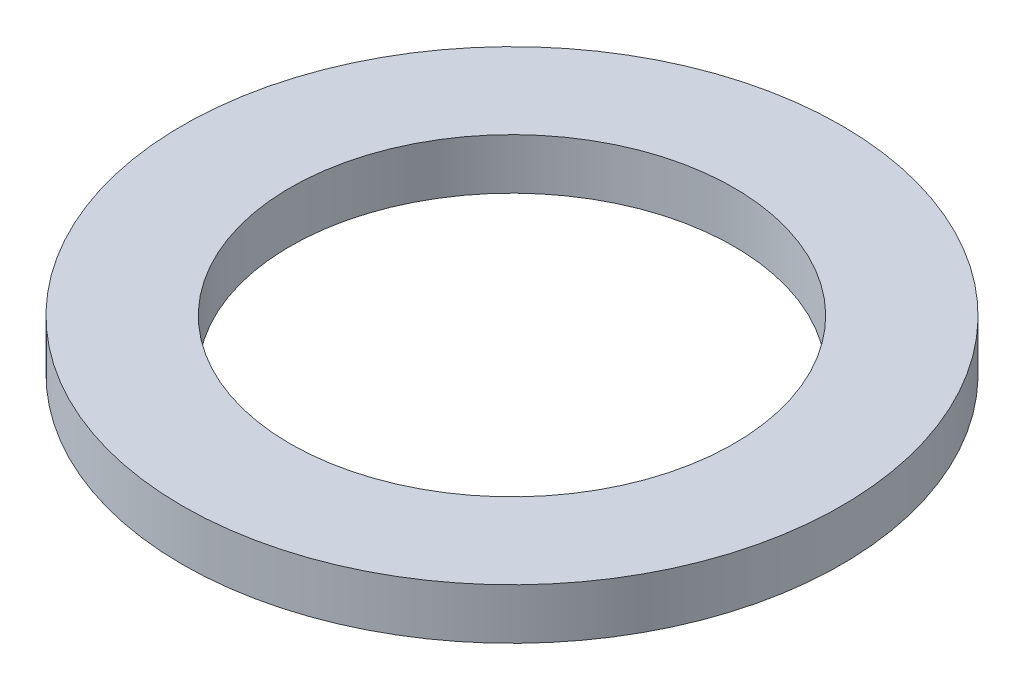
ISO-10303-21;
HEADER;
FILE_DESCRIPTION(('STEP AP214'),'2;1');
FILE_NAME('part.step','',(''),(''),'','','');
FILE_SCHEMA(('AUTOMOTIVE_DESIGN { 1 0 10303 214 1 1 1 1 }'));
ENDSEC;
DATA;
#1=APPLICATION_CONTEXT('core data for automotive mechanical design processes');
#2=APPLICATION_PROTOCOL_DEFINITION('international standard','automotive_design',2000,#1);
#3=PRODUCT_CONTEXT('',#1,'mechanical');
#4=PRODUCT('Part','Part','',(#3));
#5=PRODUCT_RELATED_PRODUCT_CATEGORY('part','',(#4));
#6=PRODUCT_DEFINITION_FORMATION('','',#4);
#7=PRODUCT_DEFINITION_CONTEXT('part definition',#1,'design');
#8=PRODUCT_DEFINITION('design','',#6,#7);
#9=PRODUCT_DEFINITION_SHAPE('','',#8);
#10=(LENGTH_UNIT() NAMED_UNIT(*) SI_UNIT(.MILLI.,.METRE.));
#11=(NAMED_UNIT(*) PLANE_ANGLE_UNIT() SI_UNIT($,.RADIAN.));
#12=(NAMED_UNIT(*) SI_UNIT($,.STERADIAN.) SOLID_ANGLE_UNIT());
#13=UNCERTAINTY_MEASURE_WITH_UNIT(LENGTH_MEASURE(1.E-05),#10,'distance_accuracy_value','');
#14=(GEOMETRIC_REPRESENTATION_CONTEXT(3) GLOBAL_UNCERTAINTY_ASSIGNED_CONTEXT((#13)) GLOBAL_UNIT_ASSIGNED_CONTEXT((#10,
#11,#12)) REPRESENTATION_CONTEXT('',''));
#15=CARTESIAN_POINT('',(0.,0.,0.));
#16=DIRECTION('',(0.,0.,1.));
#17=DIRECTION('',(1.,0.,0.));
#18=AXIS2_PLACEMENT_3D('',#15,#16,#17);
#19=CARTESIAN_POINT('',(0.,4.,0.));
#20=DIRECTION('',(0.,1.,0.));
#21=DIRECTION('',(0.,0.,1.));
#22=AXIS2_PLACEMENT_3D('',#19,#20,#21);
#23=PLANE('',#22);
#24=CARTESIAN_POINT('',(0.,4.,0.));
#25=DIRECTION('',(0.,1.,0.));
#26=DIRECTION('',(0.,0.,1.));
#27=AXIS2_PLACEMENT_3D('',#24,#25,#26);
#28=CIRCLE('',#27,26.);
#29=CARTESIAN_POINT('',(0.,4.,26.));
#30=VERTEX_POINT('',#29);
#31=EDGE_CURVE('E10',#30,#30,#28,.T.);
#32=ORIENTED_EDGE('',*,*,#31,.T.);
#33=EDGE_LOOP('',(#32));
#34=FACE_BOUND('',#33,.T.);
#35=CARTESIAN_POINT('',(0.,4.,0.));
#36=DIRECTION('',(0.,1.,0.));
#37=DIRECTION('',(0.,0.,1.));
#38=AXIS2_PLACEMENT_3D('',#35,#36,#37);
#39=CIRCLE('',#38,17.5);
#40=CARTESIAN_POINT('',(0.,4.,17.5));
#41=VERTEX_POINT('',#40);
#42=EDGE_CURVE('E50',#41,#41,#39,.T.);
#43=ORIENTED_EDGE('',*,*,#42,.F.);
#44=EDGE_LOOP('',(#43));
#45=FACE_BOUND('',#44,.T.);
#46=ADVANCED_FACE('F39',(#34,#45),#23,.T.);
#47=CARTESIAN_POINT('',(0.,0.,0.));
#48=DIRECTION('',(0.,1.,0.));
#49=DIRECTION('',(0.,0.,1.));
#50=AXIS2_PLACEMENT_3D('',#47,#48,#49);
#51=PLANE('',#50);
#52=CARTESIAN_POINT('',(0.,0.,0.));
#53=DIRECTION('',(0.,1.,0.));
#54=DIRECTION('',(0.,0.,1.));
#55=AXIS2_PLACEMENT_3D('',#52,#53,#54);
#56=CIRCLE('',#55,26.);
#57=CARTESIAN_POINT('',(0.,0.,26.));
#58=VERTEX_POINT('',#57);
#59=EDGE_CURVE('E43',#58,#58,#56,.T.);
#60=ORIENTED_EDGE('',*,*,#59,.F.);
#61=EDGE_LOOP('',(#60));
#62=FACE_BOUND('',#61,.T.);
#63=CARTESIAN_POINT('',(0.,0.,0.));
#64=DIRECTION('',(0.,1.,0.));
#65=DIRECTION('',(0.,0.,1.));
#66=AXIS2_PLACEMENT_3D('',#63,#64,#65);
#67=CIRCLE('',#66,17.5);
#68=CARTESIAN_POINT('',(0.,0.,17.5));
#69=VERTEX_POINT('',#68);
#70=EDGE_CURVE('E52',#69,#69,#67,.T.);
#71=ORIENTED_EDGE('',*,*,#70,.T.);
#72=EDGE_LOOP('',(#71));
#73=FACE_BOUND('',#72,.T.);
#74=ADVANCED_FACE('F62',(#62,#73),#51,.F.);
#75=CARTESIAN_POINT('',(0.,4.,0.));
#76=DIRECTION('',(0.,-1.,0.));
#77=DIRECTION('',(0.,0.,-1.));
#78=AXIS2_PLACEMENT_3D('',#75,#76,#77);
#79=CYLINDRICAL_SURFACE('',#78,26.);
#80=ORIENTED_EDGE('',*,*,#31,.F.);
#81=EDGE_LOOP('',(#80));
#82=FACE_BOUND('',#81,.T.);
#83=ORIENTED_EDGE('',*,*,#59,.T.);
#84=EDGE_LOOP('',(#83));
#85=FACE_BOUND('',#84,.T.);
#86=ADVANCED_FACE('F41',(#82,#85),#79,.T.);
#87=CARTESIAN_POINT('',(0.,4.,0.));
#88=DIRECTION('',(0.,-1.,0.));
#89=DIRECTION('',(0.,0.,-1.));
#90=AXIS2_PLACEMENT_3D('',#87,#88,#89);
#91=CYLINDRICAL_SURFACE('',#90,17.5);
#92=ORIENTED_EDGE('',*,*,#42,.T.);
#93=EDGE_LOOP('',(#92));
#94=FACE_BOUND('',#93,.T.);
#95=ORIENTED_EDGE('',*,*,#70,.F.);
#96=EDGE_LOOP('',(#95));
#97=FACE_BOUND('',#96,.T.);
#98=ADVANCED_FACE('F58',(#94,#97),#91,.F.);
#99=CLOSED_SHELL('',(#46,#74,#86,#98));
#100=MANIFOLD_SOLID_BREP('B2',#99);
#101=ADVANCED_BREP_SHAPE_REPRESENTATION('',(#18,#100),#14);
#102=SHAPE_DEFINITION_REPRESENTATION(#9,#101);
ENDSEC;
END-ISO-10303-21;
